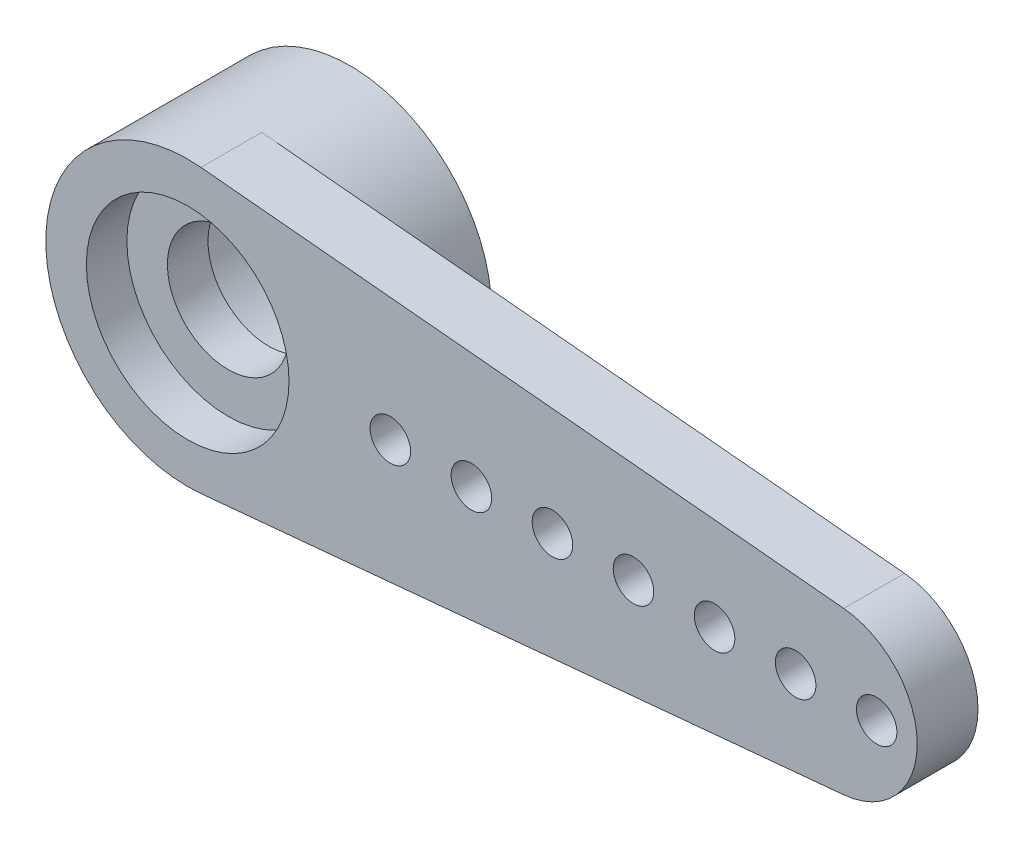
ISO-10303-21;
HEADER;
FILE_DESCRIPTION(('STEP AP214'),'2;1');
FILE_NAME('part.step','',(''),(''),'','','');
FILE_SCHEMA(('AUTOMOTIVE_DESIGN { 1 0 10303 214 1 1 1 1 }'));
ENDSEC;
DATA;
#1=APPLICATION_CONTEXT('core data for automotive mechanical design processes');
#2=APPLICATION_PROTOCOL_DEFINITION('international standard','automotive_design',2000,#1);
#3=PRODUCT_CONTEXT('',#1,'mechanical');
#4=PRODUCT('Part','Part','',(#3));
#5=PRODUCT_RELATED_PRODUCT_CATEGORY('part','',(#4));
#6=PRODUCT_DEFINITION_FORMATION('','',#4);
#7=PRODUCT_DEFINITION_CONTEXT('part definition',#1,'design');
#8=PRODUCT_DEFINITION('design','',#6,#7);
#9=PRODUCT_DEFINITION_SHAPE('','',#8);
#10=(LENGTH_UNIT() NAMED_UNIT(*) SI_UNIT(.MILLI.,.METRE.));
#11=(NAMED_UNIT(*) PLANE_ANGLE_UNIT() SI_UNIT($,.RADIAN.));
#12=(NAMED_UNIT(*) SI_UNIT($,.STERADIAN.) SOLID_ANGLE_UNIT());
#13=UNCERTAINTY_MEASURE_WITH_UNIT(LENGTH_MEASURE(1.E-05),#10,'distance_accuracy_value','');
#14=(GEOMETRIC_REPRESENTATION_CONTEXT(3) GLOBAL_UNCERTAINTY_ASSIGNED_CONTEXT((#13)) GLOBAL_UNIT_ASSIGNED_CONTEXT((#10,
#11,#12)) REPRESENTATION_CONTEXT('',''));
#15=CARTESIAN_POINT('',(0.,0.,0.));
#16=DIRECTION('',(0.,0.,1.));
#17=DIRECTION('',(1.,0.,0.));
#18=AXIS2_PLACEMENT_3D('',#15,#16,#17);
#19=CARTESIAN_POINT('',(0.,0.,55.));
#20=DIRECTION('',(0.,0.,-1.));
#21=DIRECTION('',(-1.,0.,0.));
#22=AXIS2_PLACEMENT_3D('',#19,#20,#21);
#23=CYLINDRICAL_SURFACE('',#22,1.5);
#24=CARTESIAN_POINT('',(0.,0.,2.));
#25=DIRECTION('',(0.,0.,-1.));
#26=DIRECTION('',(-1.,0.,0.));
#27=AXIS2_PLACEMENT_3D('',#24,#25,#26);
#28=CIRCLE('',#27,1.5);
#29=CARTESIAN_POINT('',(-1.5,0.,2.));
#30=VERTEX_POINT('',#29);
#31=EDGE_CURVE('E114',#30,#30,#28,.F.);
#32=ORIENTED_EDGE('',*,*,#31,.F.);
#33=EDGE_LOOP('',(#32));
#34=FACE_BOUND('',#33,.T.);
#35=CARTESIAN_POINT('',(0.,0.,3.));
#36=DIRECTION('',(0.,0.,1.));
#37=DIRECTION('',(1.,0.,0.));
#38=AXIS2_PLACEMENT_3D('',#35,#36,#37);
#39=CIRCLE('',#38,1.5);
#40=CARTESIAN_POINT('',(1.5,0.,3.));
#41=VERTEX_POINT('',#40);
#42=EDGE_CURVE('E40',#41,#41,#39,.F.);
#43=ORIENTED_EDGE('',*,*,#42,.F.);
#44=EDGE_LOOP('',(#43));
#45=FACE_BOUND('',#44,.T.);
#46=ADVANCED_FACE('F36',(#34,#45),#23,.F.);
#47=CARTESIAN_POINT('',(0.,0.,4.));
#48=DIRECTION('',(0.,0.,-1.));
#49=DIRECTION('',(-1.,0.,0.));
#50=AXIS2_PLACEMENT_3D('',#47,#48,#49);
#51=CYLINDRICAL_SURFACE('',#50,3.5);
#52=CARTESIAN_POINT('',(0.,0.,4.));
#53=DIRECTION('',(0.,0.,1.));
#54=DIRECTION('',(1.,0.,0.));
#55=AXIS2_PLACEMENT_3D('',#52,#53,#54);
#56=CIRCLE('',#55,3.5);
#57=CARTESIAN_POINT('',(0.328125,3.48458519545369,4.));
#58=VERTEX_POINT('',#57);
#59=CARTESIAN_POINT('',(0.328125,-3.48458519545369,4.));
#60=VERTEX_POINT('',#59);
#61=EDGE_CURVE('E11',#58,#60,#56,.T.);
#62=ORIENTED_EDGE('',*,*,#61,.F.);
#63=DIRECTION('',(0.,0.,1.));
#64=VECTOR('',#63,1.);
#65=CARTESIAN_POINT('',(0.328125,3.48458519545369,2.5));
#66=LINE('',#65,#64);
#67=CARTESIAN_POINT('',(0.328125,3.48458519545369,2.5));
#68=VERTEX_POINT('',#67);
#69=EDGE_CURVE('E109',#68,#58,#66,.T.);
#70=ORIENTED_EDGE('',*,*,#69,.F.);
#71=CARTESIAN_POINT('',(0.,0.,2.5));
#72=DIRECTION('',(0.,0.,-1.));
#73=DIRECTION('',(1.,0.,0.));
#74=AXIS2_PLACEMENT_3D('',#71,#72,#73);
#75=CIRCLE('',#74,3.5);
#76=CARTESIAN_POINT('',(0.328125,-3.48458519545369,2.5));
#77=VERTEX_POINT('',#76);
#78=EDGE_CURVE('E61',#68,#77,#75,.T.);
#79=ORIENTED_EDGE('',*,*,#78,.T.);
#80=DIRECTION('',(0.,0.,1.));
#81=VECTOR('',#80,1.);
#82=CARTESIAN_POINT('',(0.328125,-3.48458519545369,2.5));
#83=LINE('',#82,#81);
#84=EDGE_CURVE('E85',#77,#60,#83,.T.);
#85=ORIENTED_EDGE('',*,*,#84,.T.);
#86=EDGE_LOOP('',(#62,#70,#79,#85));
#87=FACE_BOUND('',#86,.T.);
#88=CARTESIAN_POINT('',(0.,0.,0.));
#89=DIRECTION('',(0.,0.,1.));
#90=DIRECTION('',(1.,0.,0.));
#91=AXIS2_PLACEMENT_3D('',#88,#89,#90);
#92=CIRCLE('',#91,3.5);
#93=CARTESIAN_POINT('',(3.5,0.,0.));
#94=VERTEX_POINT('',#93);
#95=EDGE_CURVE('E45',#94,#94,#92,.T.);
#96=ORIENTED_EDGE('',*,*,#95,.T.);
#97=EDGE_LOOP('',(#96));
#98=FACE_BOUND('',#97,.T.);
#99=ADVANCED_FACE('F38',(#87,#98),#51,.T.);
#100=CARTESIAN_POINT('',(0.,0.,4.));
#101=DIRECTION('',(0.,0.,1.));
#102=DIRECTION('',(1.,0.,0.));
#103=AXIS2_PLACEMENT_3D('',#100,#101,#102);
#104=PLANE('',#103);
#105=CARTESIAN_POINT('',(0.,0.,4.));
#106=DIRECTION('',(0.,0.,1.));
#107=DIRECTION('',(1.,0.,0.));
#108=AXIS2_PLACEMENT_3D('',#105,#106,#107);
#109=CIRCLE('',#108,2.5);
#110=CARTESIAN_POINT('',(2.5,0.,4.));
#111=VERTEX_POINT('',#110);
#112=EDGE_CURVE('E131',#111,#111,#109,.T.);
#113=ORIENTED_EDGE('',*,*,#112,.F.);
#114=EDGE_LOOP('',(#113));
#115=FACE_BOUND('',#114,.T.);
#116=CARTESIAN_POINT('',(17.,0.,4.));
#117=DIRECTION('',(0.,0.,-1.));
#118=DIRECTION('',(-1.,0.,0.));
#119=AXIS2_PLACEMENT_3D('',#116,#117,#118);
#120=CIRCLE('',#119,0.500000000000002);
#121=CARTESIAN_POINT('',(16.5,0.,4.));
#122=VERTEX_POINT('',#121);
#123=EDGE_CURVE('E121',#122,#122,#120,.T.);
#124=ORIENTED_EDGE('',*,*,#123,.T.);
#125=EDGE_LOOP('',(#124));
#126=FACE_BOUND('',#125,.T.);
#127=CARTESIAN_POINT('',(15.,0.,4.));
#128=DIRECTION('',(0.,0.,-1.));
#129=DIRECTION('',(-1.,0.,0.));
#130=AXIS2_PLACEMENT_3D('',#127,#128,#129);
#131=CIRCLE('',#130,0.499999999999999);
#132=CARTESIAN_POINT('',(14.5,0.,4.));
#133=VERTEX_POINT('',#132);
#134=EDGE_CURVE('E141',#133,#133,#131,.T.);
#135=ORIENTED_EDGE('',*,*,#134,.T.);
#136=EDGE_LOOP('',(#135));
#137=FACE_BOUND('',#136,.T.);
#138=CARTESIAN_POINT('',(5.,0.,4.));
#139=DIRECTION('',(0.,0.,-1.));
#140=DIRECTION('',(-1.,0.,0.));
#141=AXIS2_PLACEMENT_3D('',#138,#139,#140);
#142=CIRCLE('',#141,0.500000000000001);
#143=CARTESIAN_POINT('',(4.5,0.,4.));
#144=VERTEX_POINT('',#143);
#145=EDGE_CURVE('E134',#144,#144,#142,.T.);
#146=ORIENTED_EDGE('',*,*,#145,.T.);
#147=EDGE_LOOP('',(#146));
#148=FACE_BOUND('',#147,.T.);
#149=CARTESIAN_POINT('',(13.,0.,4.));
#150=DIRECTION('',(0.,0.,-1.));
#151=DIRECTION('',(-1.,0.,0.));
#152=AXIS2_PLACEMENT_3D('',#149,#150,#151);
#153=CIRCLE('',#152,0.500000000000002);
#154=CARTESIAN_POINT('',(12.5,0.,4.));
#155=VERTEX_POINT('',#154);
#156=EDGE_CURVE('E162',#155,#155,#153,.T.);
#157=ORIENTED_EDGE('',*,*,#156,.T.);
#158=EDGE_LOOP('',(#157));
#159=FACE_BOUND('',#158,.T.);
#160=CARTESIAN_POINT('',(11.,0.,4.));
#161=DIRECTION('',(0.,0.,-1.));
#162=DIRECTION('',(-1.,0.,0.));
#163=AXIS2_PLACEMENT_3D('',#160,#161,#162);
#164=CIRCLE('',#163,0.499999999999999);
#165=CARTESIAN_POINT('',(10.5,0.,4.));
#166=VERTEX_POINT('',#165);
#167=EDGE_CURVE('E156',#166,#166,#164,.T.);
#168=ORIENTED_EDGE('',*,*,#167,.T.);
#169=EDGE_LOOP('',(#168));
#170=FACE_BOUND('',#169,.T.);
#171=CARTESIAN_POINT('',(9.,0.,4.));
#172=DIRECTION('',(0.,0.,-1.));
#173=DIRECTION('',(-1.,0.,0.));
#174=AXIS2_PLACEMENT_3D('',#171,#172,#173);
#175=CIRCLE('',#174,0.500000000000002);
#176=CARTESIAN_POINT('',(8.5,0.,4.));
#177=VERTEX_POINT('',#176);
#178=EDGE_CURVE('E149',#177,#177,#175,.T.);
#179=ORIENTED_EDGE('',*,*,#178,.T.);
#180=EDGE_LOOP('',(#179));
#181=FACE_BOUND('',#180,.T.);
#182=CARTESIAN_POINT('',(7.,0.,4.));
#183=DIRECTION('',(0.,0.,-1.));
#184=DIRECTION('',(-1.,0.,0.));
#185=AXIS2_PLACEMENT_3D('',#182,#183,#184);
#186=CIRCLE('',#185,0.500000000000001);
#187=CARTESIAN_POINT('',(6.5,0.,4.));
#188=VERTEX_POINT('',#187);
#189=EDGE_CURVE('E106',#188,#188,#186,.T.);
#190=ORIENTED_EDGE('',*,*,#189,.T.);
#191=EDGE_LOOP('',(#190));
#192=FACE_BOUND('',#191,.T.);
#193=ORIENTED_EDGE('',*,*,#61,.T.);
#194=DIRECTION('',(0.995595770129625,0.0937500000000001,0.));
#195=VECTOR('',#194,1.);
#196=CARTESIAN_POINT('',(16.1875,-1.99119154025925,4.));
#197=LINE('',#196,#195);
#198=CARTESIAN_POINT('',(16.1875,-1.99119154025925,4.));
#199=VERTEX_POINT('',#198);
#200=EDGE_CURVE('E104',#60,#199,#197,.T.);
#201=ORIENTED_EDGE('',*,*,#200,.T.);
#202=CARTESIAN_POINT('',(16.,0.,4.));
#203=DIRECTION('',(0.,0.,1.));
#204=DIRECTION('',(1.,0.,0.));
#205=AXIS2_PLACEMENT_3D('',#202,#203,#204);
#206=CIRCLE('',#205,2.);
#207=CARTESIAN_POINT('',(16.1875,1.99119154025925,4.));
#208=VERTEX_POINT('',#207);
#209=EDGE_CURVE('E91',#199,#208,#206,.T.);
#210=ORIENTED_EDGE('',*,*,#209,.T.);
#211=DIRECTION('',(-0.995595770129625,0.09375,0.));
#212=VECTOR('',#211,1.);
#213=CARTESIAN_POINT('',(0.328125,3.48458519545369,4.));
#214=LINE('',#213,#212);
#215=EDGE_CURVE('E52',#208,#58,#214,.T.);
#216=ORIENTED_EDGE('',*,*,#215,.T.);
#217=EDGE_LOOP('',(#193,#201,#210,#216));
#218=FACE_BOUND('',#217,.T.);
#219=ADVANCED_FACE('F193',(#115,#126,#137,#148,#159,#170,#181,#192,#218),#104,.T.);
#220=CARTESIAN_POINT('',(0.,0.,0.));
#221=DIRECTION('',(0.,0.,1.));
#222=DIRECTION('',(1.,0.,0.));
#223=AXIS2_PLACEMENT_3D('',#220,#221,#222);
#224=PLANE('',#223);
#225=CARTESIAN_POINT('',(0.,0.,0.));
#226=DIRECTION('',(0.,0.,-1.));
#227=DIRECTION('',(-1.,0.,0.));
#228=AXIS2_PLACEMENT_3D('',#225,#226,#227);
#229=CIRCLE('',#228,2.5);
#230=CARTESIAN_POINT('',(-2.5,0.,0.));
#231=VERTEX_POINT('',#230);
#232=EDGE_CURVE('E124',#231,#231,#229,.T.);
#233=ORIENTED_EDGE('',*,*,#232,.F.);
#234=EDGE_LOOP('',(#233));
#235=FACE_BOUND('',#234,.T.);
#236=ORIENTED_EDGE('',*,*,#95,.F.);
#237=EDGE_LOOP('',(#236));
#238=FACE_BOUND('',#237,.T.);
#239=ADVANCED_FACE('F238',(#235,#238),#224,.F.);
#240=CARTESIAN_POINT('',(0.328125,3.48458519545369,2.5));
#241=DIRECTION('',(0.09375,0.995595770129624,0.));
#242=DIRECTION('',(-0.995595770129625,0.09375,0.));
#243=AXIS2_PLACEMENT_3D('',#240,#241,#242);
#244=PLANE('',#243);
#245=ORIENTED_EDGE('',*,*,#215,.F.);
#246=DIRECTION('',(0.,0.,1.));
#247=VECTOR('',#246,1.);
#248=CARTESIAN_POINT('',(16.1875,1.99119154025925,2.5));
#249=LINE('',#248,#247);
#250=CARTESIAN_POINT('',(16.1875,1.99119154025925,2.5));
#251=VERTEX_POINT('',#250);
#252=EDGE_CURVE('E79',#251,#208,#249,.T.);
#253=ORIENTED_EDGE('',*,*,#252,.F.);
#254=DIRECTION('',(-0.995595770129625,0.09375,0.));
#255=VECTOR('',#254,1.);
#256=CARTESIAN_POINT('',(0.328125,3.48458519545369,2.5));
#257=LINE('',#256,#255);
#258=EDGE_CURVE('E96',#251,#68,#257,.T.);
#259=ORIENTED_EDGE('',*,*,#258,.T.);
#260=ORIENTED_EDGE('',*,*,#69,.T.);
#261=EDGE_LOOP('',(#245,#253,#259,#260));
#262=FACE_BOUND('',#261,.T.);
#263=ADVANCED_FACE('F250',(#262),#244,.T.);
#264=CARTESIAN_POINT('',(16.,0.,2.5));
#265=DIRECTION('',(0.,0.,1.));
#266=DIRECTION('',(1.,0.,0.));
#267=AXIS2_PLACEMENT_3D('',#264,#265,#266);
#268=CYLINDRICAL_SURFACE('',#267,2.);
#269=ORIENTED_EDGE('',*,*,#209,.F.);
#270=DIRECTION('',(0.,0.,1.));
#271=VECTOR('',#270,1.);
#272=CARTESIAN_POINT('',(16.1875,-1.99119154025925,2.5));
#273=LINE('',#272,#271);
#274=CARTESIAN_POINT('',(16.1875,-1.99119154025925,2.5));
#275=VERTEX_POINT('',#274);
#276=EDGE_CURVE('E87',#275,#199,#273,.T.);
#277=ORIENTED_EDGE('',*,*,#276,.F.);
#278=CARTESIAN_POINT('',(16.,0.,2.5));
#279=DIRECTION('',(0.,0.,1.));
#280=DIRECTION('',(1.,0.,0.));
#281=AXIS2_PLACEMENT_3D('',#278,#279,#280);
#282=CIRCLE('',#281,2.);
#283=EDGE_CURVE('E90',#275,#251,#282,.T.);
#284=ORIENTED_EDGE('',*,*,#283,.T.);
#285=ORIENTED_EDGE('',*,*,#252,.T.);
#286=EDGE_LOOP('',(#269,#277,#284,#285));
#287=FACE_BOUND('',#286,.T.);
#288=ADVANCED_FACE('F89',(#287),#268,.T.);
#289=CARTESIAN_POINT('',(16.1875,-1.99119154025925,2.5));
#290=DIRECTION('',(0.09375,-0.995595770129624,0.));
#291=DIRECTION('',(0.995595770129625,0.0937500000000001,0.));
#292=AXIS2_PLACEMENT_3D('',#289,#290,#291);
#293=PLANE('',#292);
#294=ORIENTED_EDGE('',*,*,#200,.F.);
#295=ORIENTED_EDGE('',*,*,#84,.F.);
#296=DIRECTION('',(0.995595770129625,0.0937500000000001,0.));
#297=VECTOR('',#296,1.);
#298=CARTESIAN_POINT('',(16.1875,-1.99119154025925,2.5));
#299=LINE('',#298,#297);
#300=EDGE_CURVE('E95',#77,#275,#299,.T.);
#301=ORIENTED_EDGE('',*,*,#300,.T.);
#302=ORIENTED_EDGE('',*,*,#276,.T.);
#303=EDGE_LOOP('',(#294,#295,#301,#302));
#304=FACE_BOUND('',#303,.T.);
#305=ADVANCED_FACE('F98',(#304),#293,.T.);
#306=CARTESIAN_POINT('',(0.,0.,2.5));
#307=DIRECTION('',(0.,0.,1.));
#308=DIRECTION('',(1.,0.,0.));
#309=AXIS2_PLACEMENT_3D('',#306,#307,#308);
#310=PLANE('',#309);
#311=CARTESIAN_POINT('',(17.,0.,2.5));
#312=DIRECTION('',(0.,0.,-1.));
#313=DIRECTION('',(-1.,0.,0.));
#314=AXIS2_PLACEMENT_3D('',#311,#312,#313);
#315=CIRCLE('',#314,0.500000000000002);
#316=CARTESIAN_POINT('',(16.5,0.,2.5));
#317=VERTEX_POINT('',#316);
#318=EDGE_CURVE('E116',#317,#317,#315,.T.);
#319=ORIENTED_EDGE('',*,*,#318,.F.);
#320=EDGE_LOOP('',(#319));
#321=FACE_BOUND('',#320,.T.);
#322=CARTESIAN_POINT('',(15.,0.,2.5));
#323=DIRECTION('',(0.,0.,-1.));
#324=DIRECTION('',(-1.,0.,0.));
#325=AXIS2_PLACEMENT_3D('',#322,#323,#324);
#326=CIRCLE('',#325,0.499999999999999);
#327=CARTESIAN_POINT('',(14.5,0.,2.5));
#328=VERTEX_POINT('',#327);
#329=EDGE_CURVE('E144',#328,#328,#326,.T.);
#330=ORIENTED_EDGE('',*,*,#329,.F.);
#331=EDGE_LOOP('',(#330));
#332=FACE_BOUND('',#331,.T.);
#333=CARTESIAN_POINT('',(5.,0.,2.5));
#334=DIRECTION('',(0.,0.,-1.));
#335=DIRECTION('',(-1.,0.,0.));
#336=AXIS2_PLACEMENT_3D('',#333,#334,#335);
#337=CIRCLE('',#336,0.500000000000001);
#338=CARTESIAN_POINT('',(4.5,0.,2.5));
#339=VERTEX_POINT('',#338);
#340=EDGE_CURVE('E138',#339,#339,#337,.T.);
#341=ORIENTED_EDGE('',*,*,#340,.F.);
#342=EDGE_LOOP('',(#341));
#343=FACE_BOUND('',#342,.T.);
#344=CARTESIAN_POINT('',(13.,0.,2.5));
#345=DIRECTION('',(0.,0.,-1.));
#346=DIRECTION('',(-1.,0.,0.));
#347=AXIS2_PLACEMENT_3D('',#344,#345,#346);
#348=CIRCLE('',#347,0.500000000000002);
#349=CARTESIAN_POINT('',(12.5,0.,2.5));
#350=VERTEX_POINT('',#349);
#351=EDGE_CURVE('E137',#350,#350,#348,.T.);
#352=ORIENTED_EDGE('',*,*,#351,.F.);
#353=EDGE_LOOP('',(#352));
#354=FACE_BOUND('',#353,.T.);
#355=CARTESIAN_POINT('',(11.,0.,2.5));
#356=DIRECTION('',(0.,0.,-1.));
#357=DIRECTION('',(-1.,0.,0.));
#358=AXIS2_PLACEMENT_3D('',#355,#356,#357);
#359=CIRCLE('',#358,0.499999999999999);
#360=CARTESIAN_POINT('',(10.5,0.,2.5));
#361=VERTEX_POINT('',#360);
#362=EDGE_CURVE('E159',#361,#361,#359,.T.);
#363=ORIENTED_EDGE('',*,*,#362,.F.);
#364=EDGE_LOOP('',(#363));
#365=FACE_BOUND('',#364,.T.);
#366=CARTESIAN_POINT('',(9.,0.,2.5));
#367=DIRECTION('',(0.,0.,-1.));
#368=DIRECTION('',(-1.,0.,0.));
#369=AXIS2_PLACEMENT_3D('',#366,#367,#368);
#370=CIRCLE('',#369,0.500000000000002);
#371=CARTESIAN_POINT('',(8.5,0.,2.5));
#372=VERTEX_POINT('',#371);
#373=EDGE_CURVE('E153',#372,#372,#370,.T.);
#374=ORIENTED_EDGE('',*,*,#373,.F.);
#375=EDGE_LOOP('',(#374));
#376=FACE_BOUND('',#375,.T.);
#377=CARTESIAN_POINT('',(7.,0.,2.5));
#378=DIRECTION('',(0.,0.,-1.));
#379=DIRECTION('',(-1.,0.,0.));
#380=AXIS2_PLACEMENT_3D('',#377,#378,#379);
#381=CIRCLE('',#380,0.500000000000001);
#382=CARTESIAN_POINT('',(6.5,0.,2.5));
#383=VERTEX_POINT('',#382);
#384=EDGE_CURVE('E152',#383,#383,#381,.T.);
#385=ORIENTED_EDGE('',*,*,#384,.F.);
#386=EDGE_LOOP('',(#385));
#387=FACE_BOUND('',#386,.T.);
#388=ORIENTED_EDGE('',*,*,#78,.F.);
#389=ORIENTED_EDGE('',*,*,#258,.F.);
#390=ORIENTED_EDGE('',*,*,#283,.F.);
#391=ORIENTED_EDGE('',*,*,#300,.F.);
#392=EDGE_LOOP('',(#388,#389,#390,#391));
#393=FACE_BOUND('',#392,.T.);
#394=ADVANCED_FACE('F94',(#321,#332,#343,#354,#365,#376,#387,#393),#310,.F.);
#395=CARTESIAN_POINT('',(7.,0.,4.));
#396=DIRECTION('',(0.,0.,-1.));
#397=DIRECTION('',(-1.,0.,0.));
#398=AXIS2_PLACEMENT_3D('',#395,#396,#397);
#399=CYLINDRICAL_SURFACE('',#398,0.500000000000001);
#400=ORIENTED_EDGE('',*,*,#189,.F.);
#401=EDGE_LOOP('',(#400));
#402=FACE_BOUND('',#401,.T.);
#403=ORIENTED_EDGE('',*,*,#384,.T.);
#404=EDGE_LOOP('',(#403));
#405=FACE_BOUND('',#404,.T.);
#406=ADVANCED_FACE('F171',(#402,#405),#399,.F.);
#407=CARTESIAN_POINT('',(9.,0.,4.));
#408=DIRECTION('',(0.,0.,-1.));
#409=DIRECTION('',(-1.,0.,0.));
#410=AXIS2_PLACEMENT_3D('',#407,#408,#409);
#411=CYLINDRICAL_SURFACE('',#410,0.500000000000002);
#412=ORIENTED_EDGE('',*,*,#178,.F.);
#413=EDGE_LOOP('',(#412));
#414=FACE_BOUND('',#413,.T.);
#415=ORIENTED_EDGE('',*,*,#373,.T.);
#416=EDGE_LOOP('',(#415));
#417=FACE_BOUND('',#416,.T.);
#418=ADVANCED_FACE('F180',(#414,#417),#411,.F.);
#419=CARTESIAN_POINT('',(11.,0.,4.));
#420=DIRECTION('',(0.,0.,-1.));
#421=DIRECTION('',(-1.,0.,0.));
#422=AXIS2_PLACEMENT_3D('',#419,#420,#421);
#423=CYLINDRICAL_SURFACE('',#422,0.499999999999999);
#424=ORIENTED_EDGE('',*,*,#167,.F.);
#425=EDGE_LOOP('',(#424));
#426=FACE_BOUND('',#425,.T.);
#427=ORIENTED_EDGE('',*,*,#362,.T.);
#428=EDGE_LOOP('',(#427));
#429=FACE_BOUND('',#428,.T.);
#430=ADVANCED_FACE('F216',(#426,#429),#423,.F.);
#431=CARTESIAN_POINT('',(13.,0.,4.));
#432=DIRECTION('',(0.,0.,-1.));
#433=DIRECTION('',(-1.,0.,0.));
#434=AXIS2_PLACEMENT_3D('',#431,#432,#433);
#435=CYLINDRICAL_SURFACE('',#434,0.500000000000002);
#436=ORIENTED_EDGE('',*,*,#156,.F.);
#437=EDGE_LOOP('',(#436));
#438=FACE_BOUND('',#437,.T.);
#439=ORIENTED_EDGE('',*,*,#351,.T.);
#440=EDGE_LOOP('',(#439));
#441=FACE_BOUND('',#440,.T.);
#442=ADVANCED_FACE('F204',(#438,#441),#435,.F.);
#443=CARTESIAN_POINT('',(5.,0.,4.));
#444=DIRECTION('',(0.,0.,-1.));
#445=DIRECTION('',(-1.,0.,0.));
#446=AXIS2_PLACEMENT_3D('',#443,#444,#445);
#447=CYLINDRICAL_SURFACE('',#446,0.500000000000001);
#448=ORIENTED_EDGE('',*,*,#145,.F.);
#449=EDGE_LOOP('',(#448));
#450=FACE_BOUND('',#449,.T.);
#451=ORIENTED_EDGE('',*,*,#340,.T.);
#452=EDGE_LOOP('',(#451));
#453=FACE_BOUND('',#452,.T.);
#454=ADVANCED_FACE('F200',(#450,#453),#447,.F.);
#455=CARTESIAN_POINT('',(15.,0.,4.));
#456=DIRECTION('',(0.,0.,-1.));
#457=DIRECTION('',(-1.,0.,0.));
#458=AXIS2_PLACEMENT_3D('',#455,#456,#457);
#459=CYLINDRICAL_SURFACE('',#458,0.499999999999999);
#460=ORIENTED_EDGE('',*,*,#134,.F.);
#461=EDGE_LOOP('',(#460));
#462=FACE_BOUND('',#461,.T.);
#463=ORIENTED_EDGE('',*,*,#329,.T.);
#464=EDGE_LOOP('',(#463));
#465=FACE_BOUND('',#464,.T.);
#466=ADVANCED_FACE('F203',(#462,#465),#459,.F.);
#467=CARTESIAN_POINT('',(17.,0.,4.));
#468=DIRECTION('',(0.,0.,-1.));
#469=DIRECTION('',(-1.,0.,0.));
#470=AXIS2_PLACEMENT_3D('',#467,#468,#469);
#471=CYLINDRICAL_SURFACE('',#470,0.500000000000002);
#472=ORIENTED_EDGE('',*,*,#123,.F.);
#473=EDGE_LOOP('',(#472));
#474=FACE_BOUND('',#473,.T.);
#475=ORIENTED_EDGE('',*,*,#318,.T.);
#476=EDGE_LOOP('',(#475));
#477=FACE_BOUND('',#476,.T.);
#478=ADVANCED_FACE('F208',(#474,#477),#471,.F.);
#479=CARTESIAN_POINT('',(0.,0.,2.));
#480=DIRECTION('',(0.,0.,-1.));
#481=DIRECTION('',(-1.,0.,0.));
#482=AXIS2_PLACEMENT_3D('',#479,#480,#481);
#483=PLANE('',#482);
#484=CARTESIAN_POINT('',(0.,0.,2.));
#485=DIRECTION('',(0.,0.,-1.));
#486=DIRECTION('',(-1.,0.,0.));
#487=AXIS2_PLACEMENT_3D('',#484,#485,#486);
#488=CIRCLE('',#487,2.5);
#489=CARTESIAN_POINT('',(-2.5,0.,2.));
#490=VERTEX_POINT('',#489);
#491=EDGE_CURVE('E117',#490,#490,#488,.T.);
#492=ORIENTED_EDGE('',*,*,#491,.T.);
#493=EDGE_LOOP('',(#492));
#494=FACE_BOUND('',#493,.T.);
#495=ORIENTED_EDGE('',*,*,#31,.T.);
#496=EDGE_LOOP('',(#495));
#497=FACE_BOUND('',#496,.T.);
#498=ADVANCED_FACE('F212',(#494,#497),#483,.T.);
#499=CARTESIAN_POINT('',(0.,0.,2.));
#500=DIRECTION('',(0.,0.,-1.));
#501=DIRECTION('',(-1.,0.,0.));
#502=AXIS2_PLACEMENT_3D('',#499,#500,#501);
#503=CYLINDRICAL_SURFACE('',#502,2.5);
#504=ORIENTED_EDGE('',*,*,#491,.F.);
#505=EDGE_LOOP('',(#504));
#506=FACE_BOUND('',#505,.T.);
#507=ORIENTED_EDGE('',*,*,#232,.T.);
#508=EDGE_LOOP('',(#507));
#509=FACE_BOUND('',#508,.T.);
#510=ADVANCED_FACE('F198',(#506,#509),#503,.F.);
#511=CARTESIAN_POINT('',(0.,0.,3.));
#512=DIRECTION('',(0.,0.,1.));
#513=DIRECTION('',(1.,0.,0.));
#514=AXIS2_PLACEMENT_3D('',#511,#512,#513);
#515=PLANE('',#514);
#516=CARTESIAN_POINT('',(0.,0.,3.));
#517=DIRECTION('',(0.,0.,1.));
#518=DIRECTION('',(1.,0.,0.));
#519=AXIS2_PLACEMENT_3D('',#516,#517,#518);
#520=CIRCLE('',#519,2.5);
#521=CARTESIAN_POINT('',(2.5,0.,3.));
#522=VERTEX_POINT('',#521);
#523=EDGE_CURVE('E284',#522,#522,#520,.T.);
#524=ORIENTED_EDGE('',*,*,#523,.T.);
#525=EDGE_LOOP('',(#524));
#526=FACE_BOUND('',#525,.T.);
#527=ORIENTED_EDGE('',*,*,#42,.T.);
#528=EDGE_LOOP('',(#527));
#529=FACE_BOUND('',#528,.T.);
#530=ADVANCED_FACE('F265',(#526,#529),#515,.T.);
#531=CARTESIAN_POINT('',(0.,0.,3.));
#532=DIRECTION('',(0.,0.,1.));
#533=DIRECTION('',(1.,0.,0.));
#534=AXIS2_PLACEMENT_3D('',#531,#532,#533);
#535=CYLINDRICAL_SURFACE('',#534,2.5);
#536=ORIENTED_EDGE('',*,*,#523,.F.);
#537=EDGE_LOOP('',(#536));
#538=FACE_BOUND('',#537,.T.);
#539=ORIENTED_EDGE('',*,*,#112,.T.);
#540=EDGE_LOOP('',(#539));
#541=FACE_BOUND('',#540,.T.);
#542=ADVANCED_FACE('F271',(#538,#541),#535,.F.);
#543=CLOSED_SHELL('',(#46,#99,#219,#239,#263,#288,#305,#394,#406,#418,#430,#442,#454,#466,#478,
#498,#510,#530,#542));
#544=MANIFOLD_SOLID_BREP('B2',#543);
#545=ADVANCED_BREP_SHAPE_REPRESENTATION('',(#18,#544),#14);
#546=SHAPE_DEFINITION_REPRESENTATION(#9,#545);
ENDSEC;
END-ISO-10303-21;
